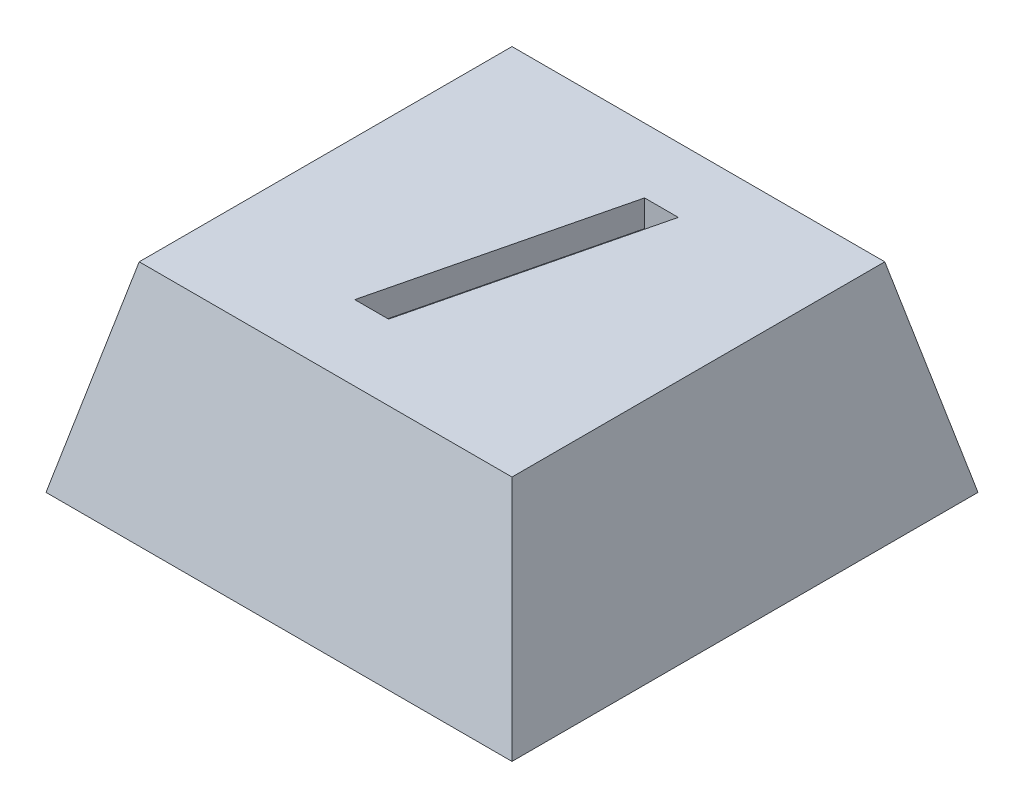
ISO-10303-21;
HEADER;
FILE_DESCRIPTION(('STEP AP214'),'2;1');
FILE_NAME('part.step','',(''),(''),'','','');
FILE_SCHEMA(('AUTOMOTIVE_DESIGN { 1 0 10303 214 1 1 1 1 }'));
ENDSEC;
DATA;
#1=APPLICATION_CONTEXT('core data for automotive mechanical design processes');
#2=APPLICATION_PROTOCOL_DEFINITION('international standard','automotive_design',2000,#1);
#3=PRODUCT_CONTEXT('',#1,'mechanical');
#4=PRODUCT('Part','Part','',(#3));
#5=PRODUCT_RELATED_PRODUCT_CATEGORY('part','',(#4));
#6=PRODUCT_DEFINITION_FORMATION('','',#4);
#7=PRODUCT_DEFINITION_CONTEXT('part definition',#1,'design');
#8=PRODUCT_DEFINITION('design','',#6,#7);
#9=PRODUCT_DEFINITION_SHAPE('','',#8);
#10=(LENGTH_UNIT() NAMED_UNIT(*) SI_UNIT(.MILLI.,.METRE.));
#11=(NAMED_UNIT(*) PLANE_ANGLE_UNIT() SI_UNIT($,.RADIAN.));
#12=(NAMED_UNIT(*) SI_UNIT($,.STERADIAN.) SOLID_ANGLE_UNIT());
#13=UNCERTAINTY_MEASURE_WITH_UNIT(LENGTH_MEASURE(1.E-05),#10,'distance_accuracy_value','');
#14=(GEOMETRIC_REPRESENTATION_CONTEXT(3) GLOBAL_UNCERTAINTY_ASSIGNED_CONTEXT((#13)) GLOBAL_UNIT_ASSIGNED_CONTEXT((#10,
#11,#12)) REPRESENTATION_CONTEXT('',''));
#15=CARTESIAN_POINT('',(0.,0.,0.));
#16=DIRECTION('',(0.,0.,1.));
#17=DIRECTION('',(1.,0.,0.));
#18=AXIS2_PLACEMENT_3D('',#15,#16,#17);
#19=CARTESIAN_POINT('',(0.,3.,0.));
#20=DIRECTION('',(0.,-1.,0.));
#21=DIRECTION('',(0.,0.,-1.));
#22=AXIS2_PLACEMENT_3D('',#19,#20,#21);
#23=PLANE('',#22);
#24=DIRECTION('',(-1.,0.,0.));
#25=VECTOR('',#24,1.);
#26=CARTESIAN_POINT('',(11.,3.,-0.7));
#27=LINE('',#26,#25);
#28=CARTESIAN_POINT('',(6.3,3.,-0.7));
#29=VERTEX_POINT('',#28);
#30=CARTESIAN_POINT('',(0.7,3.,-0.7));
#31=VERTEX_POINT('',#30);
#32=EDGE_CURVE('E65',#29,#31,#27,.T.);
#33=ORIENTED_EDGE('',*,*,#32,.F.);
#34=DIRECTION('',(0.,0.,1.));
#35=VECTOR('',#34,1.);
#36=CARTESIAN_POINT('',(6.3,3.,-7.));
#37=LINE('',#36,#35);
#38=CARTESIAN_POINT('',(6.3,3.,-6.3));
#39=VERTEX_POINT('',#38);
#40=EDGE_CURVE('E157',#39,#29,#37,.T.);
#41=ORIENTED_EDGE('',*,*,#40,.F.);
#42=DIRECTION('',(-1.,0.,0.));
#43=VECTOR('',#42,1.);
#44=CARTESIAN_POINT('',(11.,3.,-6.3));
#45=LINE('',#44,#43);
#46=CARTESIAN_POINT('',(0.699999999999998,3.,-6.3));
#47=VERTEX_POINT('',#46);
#48=EDGE_CURVE('E144',#39,#47,#45,.T.);
#49=ORIENTED_EDGE('',*,*,#48,.T.);
#50=DIRECTION('',(0.,0.,1.));
#51=VECTOR('',#50,1.);
#52=CARTESIAN_POINT('',(0.7,3.,-7.));
#53=LINE('',#52,#51);
#54=EDGE_CURVE('E158',#47,#31,#53,.T.);
#55=ORIENTED_EDGE('',*,*,#54,.T.);
#56=EDGE_LOOP('',(#33,#41,#49,#55));
#57=FACE_BOUND('',#56,.T.);
#58=DIRECTION('',(-1.,0.,0.));
#59=VECTOR('',#58,1.);
#60=CARTESIAN_POINT('',(3.31889298062819,3.,-1.82675202785535));
#61=LINE('',#60,#59);
#62=CARTESIAN_POINT('',(3.31889298062819,3.,-1.82675202785535));
#63=VERTEX_POINT('',#62);
#64=CARTESIAN_POINT('',(2.81128080114101,3.,-1.82675202785535));
#65=VERTEX_POINT('',#64);
#66=EDGE_CURVE('E58',#63,#65,#61,.T.);
#67=ORIENTED_EDGE('',*,*,#66,.T.);
#68=DIRECTION('',(0.23685313162707,0.,-0.9715454667891));
#69=VECTOR('',#68,1.);
#70=CARTESIAN_POINT('',(2.81128080114101,3.,-1.82675202785535));
#71=LINE('',#70,#69);
#72=CARTESIAN_POINT('',(3.66454602549998,3.,-5.32675202785535));
#73=VERTEX_POINT('',#72);
#74=EDGE_CURVE('E128',#65,#73,#71,.T.);
#75=ORIENTED_EDGE('',*,*,#74,.T.);
#76=DIRECTION('',(1.,0.,0.));
#77=VECTOR('',#76,1.);
#78=CARTESIAN_POINT('',(3.66454602549998,3.,-5.32675202785535));
#79=LINE('',#78,#77);
#80=CARTESIAN_POINT('',(4.17145708319229,3.,-5.32675202785535));
#81=VERTEX_POINT('',#80);
#82=EDGE_CURVE('E341',#73,#81,#79,.T.);
#83=ORIENTED_EDGE('',*,*,#82,.T.);
#84=DIRECTION('',(-0.23666941653505,0.,0.971590236301785));
#85=VECTOR('',#84,1.);
#86=CARTESIAN_POINT('',(4.17145708319229,3.,-5.32675202785535));
#87=LINE('',#86,#85);
#88=EDGE_CURVE('E124',#81,#63,#87,.T.);
#89=ORIENTED_EDGE('',*,*,#88,.T.);
#90=EDGE_LOOP('',(#67,#75,#83,#89));
#91=FACE_BOUND('',#90,.T.);
#92=ADVANCED_FACE('F42',(#57,#91),#23,.F.);
#93=CARTESIAN_POINT('',(7.,0.,-7.));
#94=DIRECTION('',(-0.973841209741793,-0.227229615606418,0.));
#95=DIRECTION('',(0.227229615606418,-0.973841209741793,0.));
#96=AXIS2_PLACEMENT_3D('',#93,#94,#95);
#97=PLANE('',#96);
#98=DIRECTION('',(-0.221581128241521,0.949633406749377,-0.221581128241521));
#99=VECTOR('',#98,1.);
#100=CARTESIAN_POINT('',(6.6563126252505,1.47294589178357,-0.343687374749499));
#101=LINE('',#100,#99);
#102=CARTESIAN_POINT('',(7.,0.,0.));
#103=VERTEX_POINT('',#102);
#104=EDGE_CURVE('E154',#103,#29,#101,.T.);
#105=ORIENTED_EDGE('',*,*,#104,.F.);
#106=DIRECTION('',(0.,0.,-1.));
#107=VECTOR('',#106,1.);
#108=CARTESIAN_POINT('',(7.,0.,0.));
#109=LINE('',#108,#107);
#110=CARTESIAN_POINT('',(7.,0.,-7.));
#111=VERTEX_POINT('',#110);
#112=EDGE_CURVE('E172',#103,#111,#109,.T.);
#113=ORIENTED_EDGE('',*,*,#112,.T.);
#114=DIRECTION('',(0.221581128241521,-0.949633406749377,-0.221581128241521));
#115=VECTOR('',#114,1.);
#116=CARTESIAN_POINT('',(7.,0.,-7.));
#117=LINE('',#116,#115);
#118=EDGE_CURVE('E148',#39,#111,#117,.T.);
#119=ORIENTED_EDGE('',*,*,#118,.F.);
#120=ORIENTED_EDGE('',*,*,#40,.T.);
#121=EDGE_LOOP('',(#105,#113,#119,#120));
#122=FACE_BOUND('',#121,.T.);
#123=ADVANCED_FACE('F197',(#122),#97,.F.);
#124=CARTESIAN_POINT('',(0.,0.,-7.));
#125=DIRECTION('',(0.973841209741793,-0.227229615606418,0.));
#126=DIRECTION('',(0.227229615606418,0.973841209741793,0.));
#127=AXIS2_PLACEMENT_3D('',#124,#125,#126);
#128=PLANE('',#127);
#129=DIRECTION('',(-0.221581128241521,-0.949633406749378,0.221581128241521));
#130=VECTOR('',#129,1.);
#131=CARTESIAN_POINT('',(0.343687374749499,1.47294589178357,-0.3436873747495));
#132=LINE('',#131,#130);
#133=CARTESIAN_POINT('',(0.,0.,0.));
#134=VERTEX_POINT('',#133);
#135=EDGE_CURVE('E11',#31,#134,#132,.T.);
#136=ORIENTED_EDGE('',*,*,#135,.F.);
#137=ORIENTED_EDGE('',*,*,#54,.F.);
#138=DIRECTION('',(0.221581128241521,0.949633406749377,0.221581128241521));
#139=VECTOR('',#138,1.);
#140=CARTESIAN_POINT('',(0.,0.,-7.));
#141=LINE('',#140,#139);
#142=CARTESIAN_POINT('',(0.,0.,-7.));
#143=VERTEX_POINT('',#142);
#144=EDGE_CURVE('E51',#143,#47,#141,.T.);
#145=ORIENTED_EDGE('',*,*,#144,.F.);
#146=DIRECTION('',(0.,0.,1.));
#147=VECTOR('',#146,1.);
#148=CARTESIAN_POINT('',(0.,0.,0.));
#149=LINE('',#148,#147);
#150=EDGE_CURVE('E162',#143,#134,#149,.T.);
#151=ORIENTED_EDGE('',*,*,#150,.T.);
#152=EDGE_LOOP('',(#136,#137,#145,#151));
#153=FACE_BOUND('',#152,.T.);
#154=ADVANCED_FACE('F190',(#153),#128,.F.);
#155=CARTESIAN_POINT('',(0.,0.,0.));
#156=DIRECTION('',(0.,-1.,0.));
#157=DIRECTION('',(0.,0.,-1.));
#158=AXIS2_PLACEMENT_3D('',#155,#156,#157);
#159=PLANE('',#158);
#160=CARTESIAN_POINT('',(3.5,0.,-3.5));
#161=DIRECTION('',(0.,-1.,0.));
#162=DIRECTION('',(0.,0.,-1.));
#163=AXIS2_PLACEMENT_3D('',#160,#161,#162);
#164=CIRCLE('',#163,1.8);
#165=CARTESIAN_POINT('',(3.5,0.,-5.3));
#166=VERTEX_POINT('',#165);
#167=EDGE_CURVE('E130',#166,#166,#164,.T.);
#168=ORIENTED_EDGE('',*,*,#167,.F.);
#169=EDGE_LOOP('',(#168));
#170=FACE_BOUND('',#169,.T.);
#171=ORIENTED_EDGE('',*,*,#150,.F.);
#172=DIRECTION('',(-1.,0.,0.));
#173=VECTOR('',#172,1.);
#174=CARTESIAN_POINT('',(0.,0.,-7.));
#175=LINE('',#174,#173);
#176=EDGE_CURVE('E176',#111,#143,#175,.T.);
#177=ORIENTED_EDGE('',*,*,#176,.F.);
#178=ORIENTED_EDGE('',*,*,#112,.F.);
#179=DIRECTION('',(1.,0.,0.));
#180=VECTOR('',#179,1.);
#181=CARTESIAN_POINT('',(0.,0.,0.));
#182=LINE('',#181,#180);
#183=EDGE_CURVE('E169',#134,#103,#182,.T.);
#184=ORIENTED_EDGE('',*,*,#183,.F.);
#185=EDGE_LOOP('',(#171,#177,#178,#184));
#186=FACE_BOUND('',#185,.T.);
#187=ADVANCED_FACE('F44',(#170,#186),#159,.T.);
#188=CARTESIAN_POINT('',(11.,3.,-6.3));
#189=DIRECTION('',(0.,0.227229615606418,-0.973841209741793));
#190=DIRECTION('',(0.,0.973841209741793,0.227229615606418));
#191=AXIS2_PLACEMENT_3D('',#188,#189,#190);
#192=PLANE('',#191);
#193=ORIENTED_EDGE('',*,*,#118,.T.);
#194=ORIENTED_EDGE('',*,*,#176,.T.);
#195=ORIENTED_EDGE('',*,*,#144,.T.);
#196=ORIENTED_EDGE('',*,*,#48,.F.);
#197=EDGE_LOOP('',(#193,#194,#195,#196));
#198=FACE_BOUND('',#197,.T.);
#199=ADVANCED_FACE('F181',(#198),#192,.T.);
#200=CARTESIAN_POINT('',(11.,0.,0.));
#201=DIRECTION('',(0.,0.227229615606418,0.973841209741793));
#202=DIRECTION('',(0.,-0.973841209741793,0.227229615606418));
#203=AXIS2_PLACEMENT_3D('',#200,#201,#202);
#204=PLANE('',#203);
#205=ORIENTED_EDGE('',*,*,#104,.T.);
#206=ORIENTED_EDGE('',*,*,#32,.T.);
#207=ORIENTED_EDGE('',*,*,#135,.T.);
#208=ORIENTED_EDGE('',*,*,#183,.T.);
#209=EDGE_LOOP('',(#205,#206,#207,#208));
#210=FACE_BOUND('',#209,.T.);
#211=ADVANCED_FACE('F192',(#210),#204,.T.);
#212=CARTESIAN_POINT('',(3.5,0.8,-3.5));
#213=DIRECTION('',(0.,-1.,0.));
#214=DIRECTION('',(0.,0.,-1.));
#215=AXIS2_PLACEMENT_3D('',#212,#213,#214);
#216=CYLINDRICAL_SURFACE('',#215,1.8);
#217=CARTESIAN_POINT('',(3.5,0.8,-3.5));
#218=DIRECTION('',(0.,-1.,0.));
#219=DIRECTION('',(0.,0.,-1.));
#220=AXIS2_PLACEMENT_3D('',#217,#218,#219);
#221=CIRCLE('',#220,1.8);
#222=CARTESIAN_POINT('',(3.5,0.8,-5.3));
#223=VERTEX_POINT('',#222);
#224=EDGE_CURVE('E136',#223,#223,#221,.T.);
#225=ORIENTED_EDGE('',*,*,#224,.F.);
#226=EDGE_LOOP('',(#225));
#227=FACE_BOUND('',#226,.T.);
#228=ORIENTED_EDGE('',*,*,#167,.T.);
#229=EDGE_LOOP('',(#228));
#230=FACE_BOUND('',#229,.T.);
#231=ADVANCED_FACE('F217',(#227,#230),#216,.F.);
#232=CARTESIAN_POINT('',(3.5,0.8,-3.5));
#233=DIRECTION('',(0.,-1.,0.));
#234=DIRECTION('',(0.,0.,-1.));
#235=AXIS2_PLACEMENT_3D('',#232,#233,#234);
#236=PLANE('',#235);
#237=ORIENTED_EDGE('',*,*,#224,.T.);
#238=EDGE_LOOP('',(#237));
#239=FACE_BOUND('',#238,.T.);
#240=ADVANCED_FACE('F220',(#239),#236,.T.);
#241=CARTESIAN_POINT('',(3.31889298062819,2.6,-1.82675202785535));
#242=DIRECTION('',(0.,0.,-1.));
#243=DIRECTION('',(-1.,0.,0.));
#244=AXIS2_PLACEMENT_3D('',#241,#242,#243);
#245=PLANE('',#244);
#246=ORIENTED_EDGE('',*,*,#66,.F.);
#247=DIRECTION('',(0.,1.,0.));
#248=VECTOR('',#247,1.);
#249=CARTESIAN_POINT('',(3.31889298062819,2.6,-1.82675202785535));
#250=LINE('',#249,#248);
#251=CARTESIAN_POINT('',(3.31889298062819,2.6,-1.82675202785535));
#252=VERTEX_POINT('',#251);
#253=EDGE_CURVE('E122',#252,#63,#250,.T.);
#254=ORIENTED_EDGE('',*,*,#253,.F.);
#255=DIRECTION('',(-1.,0.,0.));
#256=VECTOR('',#255,1.);
#257=CARTESIAN_POINT('',(3.31889298062819,2.6,-1.82675202785535));
#258=LINE('',#257,#256);
#259=CARTESIAN_POINT('',(2.81128080114101,2.6,-1.82675202785535));
#260=VERTEX_POINT('',#259);
#261=EDGE_CURVE('E113',#252,#260,#258,.T.);
#262=ORIENTED_EDGE('',*,*,#261,.T.);
#263=DIRECTION('',(0.,1.,0.));
#264=VECTOR('',#263,1.);
#265=CARTESIAN_POINT('',(2.81128080114101,2.6,-1.82675202785535));
#266=LINE('',#265,#264);
#267=EDGE_CURVE('E121',#260,#65,#266,.T.);
#268=ORIENTED_EDGE('',*,*,#267,.T.);
#269=EDGE_LOOP('',(#246,#254,#262,#268));
#270=FACE_BOUND('',#269,.T.);
#271=ADVANCED_FACE('F120',(#270),#245,.T.);
#272=CARTESIAN_POINT('',(2.81128080114101,2.6,-1.82675202785535));
#273=DIRECTION('',(0.9715454667891,0.,0.23685313162707));
#274=DIRECTION('',(0.23685313162707,0.,-0.9715454667891));
#275=AXIS2_PLACEMENT_3D('',#272,#273,#274);
#276=PLANE('',#275);
#277=ORIENTED_EDGE('',*,*,#74,.F.);
#278=ORIENTED_EDGE('',*,*,#267,.F.);
#279=DIRECTION('',(0.23685313162707,0.,-0.9715454667891));
#280=VECTOR('',#279,1.);
#281=CARTESIAN_POINT('',(2.81128080114101,2.6,-1.82675202785535));
#282=LINE('',#281,#280);
#283=CARTESIAN_POINT('',(3.66454602549998,2.6,-5.32675202785535));
#284=VERTEX_POINT('',#283);
#285=EDGE_CURVE('E109',#260,#284,#282,.T.);
#286=ORIENTED_EDGE('',*,*,#285,.T.);
#287=DIRECTION('',(0.,1.,0.));
#288=VECTOR('',#287,1.);
#289=CARTESIAN_POINT('',(3.66454602549998,2.6,-5.32675202785535));
#290=LINE('',#289,#288);
#291=EDGE_CURVE('E131',#284,#73,#290,.T.);
#292=ORIENTED_EDGE('',*,*,#291,.T.);
#293=EDGE_LOOP('',(#277,#278,#286,#292));
#294=FACE_BOUND('',#293,.T.);
#295=ADVANCED_FACE('F126',(#294),#276,.T.);
#296=CARTESIAN_POINT('',(3.66454602549998,2.6,-5.32675202785535));
#297=DIRECTION('',(0.,0.,1.));
#298=DIRECTION('',(1.,0.,0.));
#299=AXIS2_PLACEMENT_3D('',#296,#297,#298);
#300=PLANE('',#299);
#301=ORIENTED_EDGE('',*,*,#82,.F.);
#302=ORIENTED_EDGE('',*,*,#291,.F.);
#303=DIRECTION('',(1.,0.,0.));
#304=VECTOR('',#303,1.);
#305=CARTESIAN_POINT('',(3.66454602549998,2.6,-5.32675202785535));
#306=LINE('',#305,#304);
#307=CARTESIAN_POINT('',(4.17145708319229,2.6,-5.32675202785535));
#308=VERTEX_POINT('',#307);
#309=EDGE_CURVE('E114',#284,#308,#306,.T.);
#310=ORIENTED_EDGE('',*,*,#309,.T.);
#311=DIRECTION('',(0.,1.,0.));
#312=VECTOR('',#311,1.);
#313=CARTESIAN_POINT('',(4.17145708319229,2.6,-5.32675202785535));
#314=LINE('',#313,#312);
#315=EDGE_CURVE('E138',#308,#81,#314,.T.);
#316=ORIENTED_EDGE('',*,*,#315,.T.);
#317=EDGE_LOOP('',(#301,#302,#310,#316));
#318=FACE_BOUND('',#317,.T.);
#319=ADVANCED_FACE('F229',(#318),#300,.T.);
#320=CARTESIAN_POINT('',(4.17145708319229,2.6,-5.32675202785535));
#321=DIRECTION('',(-0.971590236301785,0.,-0.23666941653505));
#322=DIRECTION('',(-0.23666941653505,0.,0.971590236301785));
#323=AXIS2_PLACEMENT_3D('',#320,#321,#322);
#324=PLANE('',#323);
#325=ORIENTED_EDGE('',*,*,#88,.F.);
#326=ORIENTED_EDGE('',*,*,#315,.F.);
#327=DIRECTION('',(-0.23666941653505,0.,0.971590236301785));
#328=VECTOR('',#327,1.);
#329=CARTESIAN_POINT('',(4.17145708319229,2.6,-5.32675202785535));
#330=LINE('',#329,#328);
#331=EDGE_CURVE('E351',#308,#252,#330,.T.);
#332=ORIENTED_EDGE('',*,*,#331,.T.);
#333=ORIENTED_EDGE('',*,*,#253,.T.);
#334=EDGE_LOOP('',(#325,#326,#332,#333));
#335=FACE_BOUND('',#334,.T.);
#336=ADVANCED_FACE('F232',(#335),#324,.T.);
#337=CARTESIAN_POINT('',(0.,2.6,0.));
#338=DIRECTION('',(0.,1.,0.));
#339=DIRECTION('',(0.,0.,1.));
#340=AXIS2_PLACEMENT_3D('',#337,#338,#339);
#341=PLANE('',#340);
#342=ORIENTED_EDGE('',*,*,#261,.F.);
#343=ORIENTED_EDGE('',*,*,#331,.F.);
#344=ORIENTED_EDGE('',*,*,#309,.F.);
#345=ORIENTED_EDGE('',*,*,#285,.F.);
#346=EDGE_LOOP('',(#342,#343,#344,#345));
#347=FACE_BOUND('',#346,.T.);
#348=ADVANCED_FACE('F111',(#347),#341,.T.);
#349=CLOSED_SHELL('',(#92,#123,#154,#187,#199,#211,#231,#240,#271,#295,#319,#336,#348));
#350=MANIFOLD_SOLID_BREP('B2',#349);
#351=ADVANCED_BREP_SHAPE_REPRESENTATION('',(#18,#350),#14);
#352=SHAPE_DEFINITION_REPRESENTATION(#9,#351);
ENDSEC;
END-ISO-10303-21;
